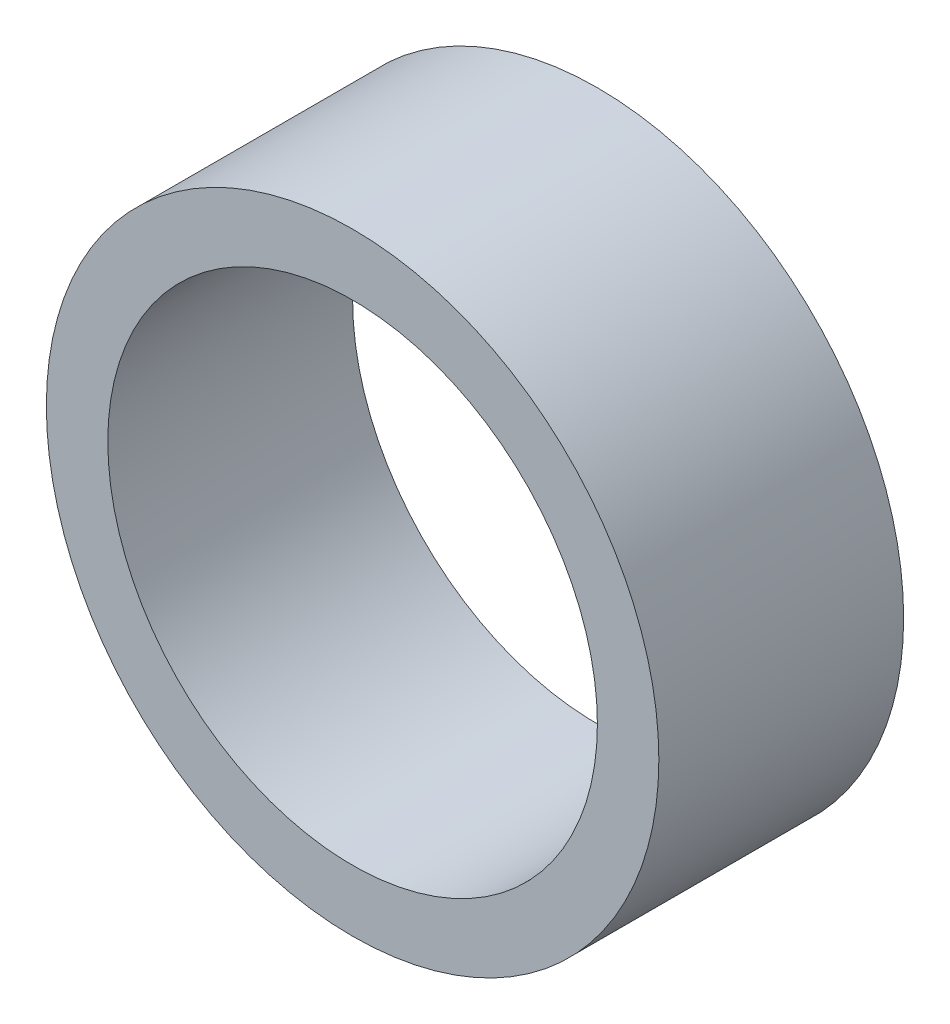
ISO-10303-21;
HEADER;
FILE_DESCRIPTION(('STEP AP214'),'2;1');
FILE_NAME('part.step','',(''),(''),'','','');
FILE_SCHEMA(('AUTOMOTIVE_DESIGN { 1 0 10303 214 1 1 1 1 }'));
ENDSEC;
DATA;
#1=APPLICATION_CONTEXT('core data for automotive mechanical design processes');
#2=APPLICATION_PROTOCOL_DEFINITION('international standard','automotive_design',2000,#1);
#3=PRODUCT_CONTEXT('',#1,'mechanical');
#4=PRODUCT('Part','Part','',(#3));
#5=PRODUCT_RELATED_PRODUCT_CATEGORY('part','',(#4));
#6=PRODUCT_DEFINITION_FORMATION('','',#4);
#7=PRODUCT_DEFINITION_CONTEXT('part definition',#1,'design');
#8=PRODUCT_DEFINITION('design','',#6,#7);
#9=PRODUCT_DEFINITION_SHAPE('','',#8);
#10=(LENGTH_UNIT() NAMED_UNIT(*) SI_UNIT(.MILLI.,.METRE.));
#11=(NAMED_UNIT(*) PLANE_ANGLE_UNIT() SI_UNIT($,.RADIAN.));
#12=(NAMED_UNIT(*) SI_UNIT($,.STERADIAN.) SOLID_ANGLE_UNIT());
#13=UNCERTAINTY_MEASURE_WITH_UNIT(LENGTH_MEASURE(1.E-05),#10,'distance_accuracy_value','');
#14=(GEOMETRIC_REPRESENTATION_CONTEXT(3) GLOBAL_UNCERTAINTY_ASSIGNED_CONTEXT((#13)) GLOBAL_UNIT_ASSIGNED_CONTEXT((#10,
#11,#12)) REPRESENTATION_CONTEXT('',''));
#15=CARTESIAN_POINT('',(0.,0.,0.));
#16=DIRECTION('',(0.,0.,1.));
#17=DIRECTION('',(1.,0.,0.));
#18=AXIS2_PLACEMENT_3D('',#15,#16,#17);
#19=CARTESIAN_POINT('',(0.,0.,6.35));
#20=DIRECTION('',(0.,0.,1.));
#21=DIRECTION('',(1.,0.,0.));
#22=AXIS2_PLACEMENT_3D('',#19,#20,#21);
#23=PLANE('',#22);
#24=CARTESIAN_POINT('',(0.,0.,6.35));
#25=DIRECTION('',(0.,0.,1.));
#26=DIRECTION('',(1.,0.,0.));
#27=AXIS2_PLACEMENT_3D('',#24,#25,#26);
#28=CIRCLE('',#27,15.8877);
#29=CARTESIAN_POINT('',(15.8877,0.,6.35));
#30=VERTEX_POINT('',#29);
#31=EDGE_CURVE('E10',#30,#30,#28,.T.);
#32=ORIENTED_EDGE('',*,*,#31,.T.);
#33=EDGE_LOOP('',(#32));
#34=FACE_BOUND('',#33,.T.);
#35=CARTESIAN_POINT('',(0.,0.,6.35));
#36=DIRECTION('',(0.,0.,1.));
#37=DIRECTION('',(1.,0.,0.));
#38=AXIS2_PLACEMENT_3D('',#35,#36,#37);
#39=CIRCLE('',#38,12.7);
#40=CARTESIAN_POINT('',(12.7,0.,6.35));
#41=VERTEX_POINT('',#40);
#42=EDGE_CURVE('E44',#41,#41,#39,.T.);
#43=ORIENTED_EDGE('',*,*,#42,.F.);
#44=EDGE_LOOP('',(#43));
#45=FACE_BOUND('',#44,.T.);
#46=ADVANCED_FACE('F33',(#34,#45),#23,.T.);
#47=CARTESIAN_POINT('',(0.,0.,-6.35));
#48=DIRECTION('',(0.,0.,1.));
#49=DIRECTION('',(1.,0.,0.));
#50=AXIS2_PLACEMENT_3D('',#47,#48,#49);
#51=PLANE('',#50);
#52=CARTESIAN_POINT('',(0.,0.,-6.35));
#53=DIRECTION('',(0.,0.,1.));
#54=DIRECTION('',(1.,0.,0.));
#55=AXIS2_PLACEMENT_3D('',#52,#53,#54);
#56=CIRCLE('',#55,15.8877);
#57=CARTESIAN_POINT('',(15.8877,0.,-6.35));
#58=VERTEX_POINT('',#57);
#59=EDGE_CURVE('E37',#58,#58,#56,.T.);
#60=ORIENTED_EDGE('',*,*,#59,.F.);
#61=EDGE_LOOP('',(#60));
#62=FACE_BOUND('',#61,.T.);
#63=CARTESIAN_POINT('',(0.,0.,-6.35));
#64=DIRECTION('',(0.,0.,1.));
#65=DIRECTION('',(1.,0.,0.));
#66=AXIS2_PLACEMENT_3D('',#63,#64,#65);
#67=CIRCLE('',#66,12.7);
#68=CARTESIAN_POINT('',(12.7,0.,-6.35));
#69=VERTEX_POINT('',#68);
#70=EDGE_CURVE('E46',#69,#69,#67,.T.);
#71=ORIENTED_EDGE('',*,*,#70,.T.);
#72=EDGE_LOOP('',(#71));
#73=FACE_BOUND('',#72,.T.);
#74=ADVANCED_FACE('F56',(#62,#73),#51,.F.);
#75=CARTESIAN_POINT('',(0.,0.,6.35));
#76=DIRECTION('',(0.,0.,-1.));
#77=DIRECTION('',(-1.,0.,0.));
#78=AXIS2_PLACEMENT_3D('',#75,#76,#77);
#79=CYLINDRICAL_SURFACE('',#78,15.8877);
#80=ORIENTED_EDGE('',*,*,#31,.F.);
#81=EDGE_LOOP('',(#80));
#82=FACE_BOUND('',#81,.T.);
#83=ORIENTED_EDGE('',*,*,#59,.T.);
#84=EDGE_LOOP('',(#83));
#85=FACE_BOUND('',#84,.T.);
#86=ADVANCED_FACE('F35',(#82,#85),#79,.T.);
#87=CARTESIAN_POINT('',(0.,0.,6.35));
#88=DIRECTION('',(0.,0.,-1.));
#89=DIRECTION('',(-1.,0.,0.));
#90=AXIS2_PLACEMENT_3D('',#87,#88,#89);
#91=CYLINDRICAL_SURFACE('',#90,12.7);
#92=ORIENTED_EDGE('',*,*,#42,.T.);
#93=EDGE_LOOP('',(#92));
#94=FACE_BOUND('',#93,.T.);
#95=ORIENTED_EDGE('',*,*,#70,.F.);
#96=EDGE_LOOP('',(#95));
#97=FACE_BOUND('',#96,.T.);
#98=ADVANCED_FACE('F52',(#94,#97),#91,.F.);
#99=CLOSED_SHELL('',(#46,#74,#86,#98));
#100=MANIFOLD_SOLID_BREP('B2',#99);
#101=ADVANCED_BREP_SHAPE_REPRESENTATION('',(#18,#100),#14);
#102=SHAPE_DEFINITION_REPRESENTATION(#9,#101);
ENDSEC;
END-ISO-10303-21;
